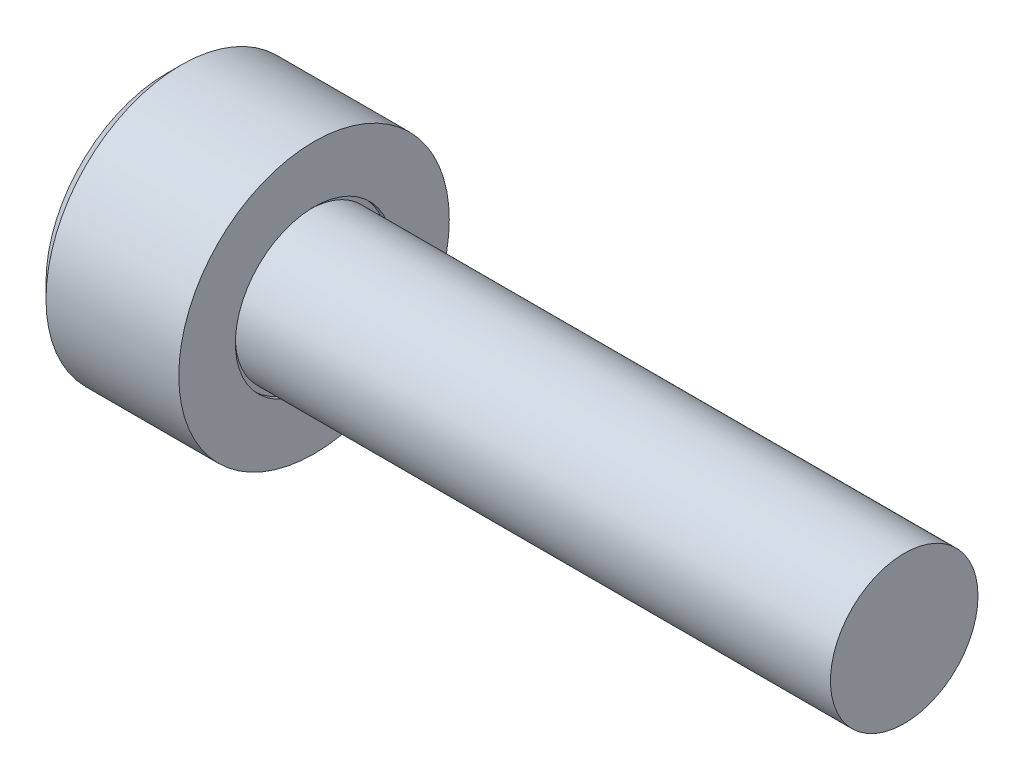
ISO-10303-21;
HEADER;
FILE_DESCRIPTION(('STEP AP214'),'2;1');
FILE_NAME('part.step','',(''),(''),'','','');
FILE_SCHEMA(('AUTOMOTIVE_DESIGN { 1 0 10303 214 1 1 1 1 }'));
ENDSEC;
DATA;
#1=APPLICATION_CONTEXT('core data for automotive mechanical design processes');
#2=APPLICATION_PROTOCOL_DEFINITION('international standard','automotive_design',2000,#1);
#3=PRODUCT_CONTEXT('',#1,'mechanical');
#4=PRODUCT('Part','Part','',(#3));
#5=PRODUCT_RELATED_PRODUCT_CATEGORY('part','',(#4));
#6=PRODUCT_DEFINITION_FORMATION('','',#4);
#7=PRODUCT_DEFINITION_CONTEXT('part definition',#1,'design');
#8=PRODUCT_DEFINITION('design','',#6,#7);
#9=PRODUCT_DEFINITION_SHAPE('','',#8);
#10=(LENGTH_UNIT() NAMED_UNIT(*) SI_UNIT(.MILLI.,.METRE.));
#11=(NAMED_UNIT(*) PLANE_ANGLE_UNIT() SI_UNIT($,.RADIAN.));
#12=(NAMED_UNIT(*) SI_UNIT($,.STERADIAN.) SOLID_ANGLE_UNIT());
#13=UNCERTAINTY_MEASURE_WITH_UNIT(LENGTH_MEASURE(1.E-05),#10,'distance_accuracy_value','');
#14=(GEOMETRIC_REPRESENTATION_CONTEXT(3) GLOBAL_UNCERTAINTY_ASSIGNED_CONTEXT((#13)) GLOBAL_UNIT_ASSIGNED_CONTEXT((#10,
#11,#12)) REPRESENTATION_CONTEXT('',''));
#15=CARTESIAN_POINT('',(0.,0.,0.));
#16=DIRECTION('',(0.,0.,1.));
#17=DIRECTION('',(1.,0.,0.));
#18=AXIS2_PLACEMENT_3D('',#15,#16,#17);
#19=CARTESIAN_POINT('',(100.,0.,0.));
#20=DIRECTION('',(-1.,0.,0.));
#21=DIRECTION('',(0.,0.,1.));
#22=AXIS2_PLACEMENT_3D('',#19,#20,#21);
#23=CYLINDRICAL_SURFACE('',#22,1.5);
#24=CARTESIAN_POINT('',(-0.1,0.,0.));
#25=DIRECTION('',(1.,0.,0.));
#26=DIRECTION('',(0.,0.,-1.));
#27=AXIS2_PLACEMENT_3D('',#24,#25,#26);
#28=CIRCLE('',#27,1.5);
#29=CARTESIAN_POINT('',(-0.1,0.,-1.5));
#30=VERTEX_POINT('',#29);
#31=EDGE_CURVE('E251',#30,#30,#28,.T.);
#32=ORIENTED_EDGE('',*,*,#31,.T.);
#33=EDGE_LOOP('',(#32));
#34=FACE_BOUND('',#33,.T.);
#35=CARTESIAN_POINT('',(12.,0.,0.));
#36=DIRECTION('',(1.,0.,0.));
#37=DIRECTION('',(0.,0.,-1.));
#38=AXIS2_PLACEMENT_3D('',#35,#36,#37);
#39=CIRCLE('',#38,1.5);
#40=CARTESIAN_POINT('',(12.,0.,-1.5));
#41=VERTEX_POINT('',#40);
#42=EDGE_CURVE('E12',#41,#41,#39,.T.);
#43=ORIENTED_EDGE('',*,*,#42,.F.);
#44=EDGE_LOOP('',(#43));
#45=FACE_BOUND('',#44,.T.);
#46=ADVANCED_FACE('F42',(#34,#45),#23,.T.);
#47=CARTESIAN_POINT('',(-1.5,0.,0.));
#48=DIRECTION('',(-1.,0.,0.));
#49=DIRECTION('',(0.,0.,1.));
#50=AXIS2_PLACEMENT_3D('',#47,#48,#49);
#51=PLANE('',#50);
#52=DIRECTION('',(0.,-0.866025403784439,-0.5));
#53=VECTOR('',#52,1.);
#54=CARTESIAN_POINT('',(-1.5,1.24707658144959,-0.72));
#55=LINE('',#54,#53);
#56=CARTESIAN_POINT('',(-1.5,1.24707658144959,-0.72));
#57=VERTEX_POINT('',#56);
#58=CARTESIAN_POINT('',(-1.5,0.623538290724796,-1.08));
#59=VERTEX_POINT('',#58);
#60=EDGE_CURVE('E198',#57,#59,#55,.T.);
#61=ORIENTED_EDGE('',*,*,#60,.T.);
#62=CARTESIAN_POINT('',(-1.5,0.,0.));
#63=DIRECTION('',(1.,0.,0.));
#64=DIRECTION('',(0.,0.,-1.));
#65=AXIS2_PLACEMENT_3D('',#62,#63,#64);
#66=CIRCLE('',#65,1.24707658144959);
#67=CARTESIAN_POINT('',(-1.5,1.24707658144959,0.));
#68=VERTEX_POINT('',#67);
#69=EDGE_CURVE('E58',#59,#68,#66,.T.);
#70=ORIENTED_EDGE('',*,*,#69,.T.);
#71=DIRECTION('',(0.,0.,-1.));
#72=VECTOR('',#71,1.);
#73=CARTESIAN_POINT('',(-1.5,1.24707658144959,0.72));
#74=LINE('',#73,#72);
#75=EDGE_CURVE('E229',#68,#57,#74,.T.);
#76=ORIENTED_EDGE('',*,*,#75,.T.);
#77=EDGE_LOOP('',(#61,#70,#76));
#78=FACE_BOUND('',#77,.T.);
#79=ADVANCED_FACE('F129',(#78),#51,.T.);
#80=CARTESIAN_POINT('',(-1.5,1.24707658144959,0.72));
#81=VERTEX_POINT('',#80);
#82=EDGE_CURVE('E224',#81,#68,#74,.T.);
#83=ORIENTED_EDGE('',*,*,#82,.T.);
#84=CARTESIAN_POINT('',(-1.5,0.623538290724796,1.08));
#85=VERTEX_POINT('',#84);
#86=EDGE_CURVE('E180',#68,#85,#66,.T.);
#87=ORIENTED_EDGE('',*,*,#86,.T.);
#88=DIRECTION('',(0.,0.866025403784439,-0.5));
#89=VECTOR('',#88,1.);
#90=CARTESIAN_POINT('',(-1.5,0.,1.44));
#91=LINE('',#90,#89);
#92=EDGE_CURVE('E237',#85,#81,#91,.T.);
#93=ORIENTED_EDGE('',*,*,#92,.T.);
#94=EDGE_LOOP('',(#83,#87,#93));
#95=FACE_BOUND('',#94,.T.);
#96=ADVANCED_FACE('F138',(#95),#51,.T.);
#97=CARTESIAN_POINT('',(-1.5,0.,1.44));
#98=VERTEX_POINT('',#97);
#99=EDGE_CURVE('E233',#98,#85,#91,.T.);
#100=ORIENTED_EDGE('',*,*,#99,.T.);
#101=CARTESIAN_POINT('',(-1.5,-0.623538290724796,1.08));
#102=VERTEX_POINT('',#101);
#103=EDGE_CURVE('E418',#85,#102,#66,.T.);
#104=ORIENTED_EDGE('',*,*,#103,.T.);
#105=DIRECTION('',(0.,0.866025403784439,0.5));
#106=VECTOR('',#105,1.);
#107=CARTESIAN_POINT('',(-1.5,-1.24707658144959,0.72));
#108=LINE('',#107,#106);
#109=EDGE_CURVE('E241',#102,#98,#108,.T.);
#110=ORIENTED_EDGE('',*,*,#109,.T.);
#111=EDGE_LOOP('',(#100,#104,#110));
#112=FACE_BOUND('',#111,.T.);
#113=ADVANCED_FACE('F392',(#112),#51,.T.);
#114=CARTESIAN_POINT('',(-1.5,-1.24707658144959,0.72));
#115=VERTEX_POINT('',#114);
#116=EDGE_CURVE('E238',#115,#102,#108,.T.);
#117=ORIENTED_EDGE('',*,*,#116,.T.);
#118=CARTESIAN_POINT('',(-1.5,-1.24707658144959,0.));
#119=VERTEX_POINT('',#118);
#120=EDGE_CURVE('E423',#102,#119,#66,.T.);
#121=ORIENTED_EDGE('',*,*,#120,.T.);
#122=DIRECTION('',(0.,0.,1.));
#123=VECTOR('',#122,1.);
#124=CARTESIAN_POINT('',(-1.5,-1.24707658144959,-0.72));
#125=LINE('',#124,#123);
#126=EDGE_CURVE('E245',#119,#115,#125,.T.);
#127=ORIENTED_EDGE('',*,*,#126,.T.);
#128=EDGE_LOOP('',(#117,#121,#127));
#129=FACE_BOUND('',#128,.T.);
#130=ADVANCED_FACE('F159',(#129),#51,.T.);
#131=CARTESIAN_POINT('',(-1.5,-1.24707658144959,-0.72));
#132=VERTEX_POINT('',#131);
#133=EDGE_CURVE('E242',#132,#119,#125,.T.);
#134=ORIENTED_EDGE('',*,*,#133,.T.);
#135=CARTESIAN_POINT('',(-1.5,-0.623538290724796,-1.08));
#136=VERTEX_POINT('',#135);
#137=EDGE_CURVE('E172',#119,#136,#66,.T.);
#138=ORIENTED_EDGE('',*,*,#137,.T.);
#139=DIRECTION('',(0.,-0.866025403784439,0.5));
#140=VECTOR('',#139,1.);
#141=CARTESIAN_POINT('',(-1.5,0.,-1.44));
#142=LINE('',#141,#140);
#143=EDGE_CURVE('E209',#136,#132,#142,.T.);
#144=ORIENTED_EDGE('',*,*,#143,.T.);
#145=EDGE_LOOP('',(#134,#138,#144));
#146=FACE_BOUND('',#145,.T.);
#147=ADVANCED_FACE('F130',(#146),#51,.T.);
#148=CARTESIAN_POINT('',(-3.,0.,0.));
#149=DIRECTION('',(1.,0.,0.));
#150=DIRECTION('',(0.,0.,-1.));
#151=AXIS2_PLACEMENT_3D('',#148,#149,#150);
#152=CYLINDRICAL_SURFACE('',#151,2.75);
#153=CARTESIAN_POINT('',(-2.7,0.,0.));
#154=DIRECTION('',(-1.,0.,0.));
#155=DIRECTION('',(0.,0.,1.));
#156=AXIS2_PLACEMENT_3D('',#153,#154,#155);
#157=CIRCLE('',#156,2.75);
#158=CARTESIAN_POINT('',(-2.7,0.,2.75));
#159=VERTEX_POINT('',#158);
#160=EDGE_CURVE('E164',#159,#159,#157,.F.);
#161=ORIENTED_EDGE('',*,*,#160,.T.);
#162=EDGE_LOOP('',(#161));
#163=FACE_BOUND('',#162,.T.);
#164=CARTESIAN_POINT('',(0.,0.,0.));
#165=DIRECTION('',(1.,0.,0.));
#166=DIRECTION('',(0.,0.,-1.));
#167=AXIS2_PLACEMENT_3D('',#164,#165,#166);
#168=CIRCLE('',#167,2.75);
#169=CARTESIAN_POINT('',(0.,0.,-2.75));
#170=VERTEX_POINT('',#169);
#171=EDGE_CURVE('E167',#170,#170,#168,.T.);
#172=ORIENTED_EDGE('',*,*,#171,.F.);
#173=EDGE_LOOP('',(#172));
#174=FACE_BOUND('',#173,.T.);
#175=ADVANCED_FACE('F152',(#163,#174),#152,.T.);
#176=CARTESIAN_POINT('',(-3.,2.75,0.));
#177=DIRECTION('',(-1.,0.,0.));
#178=DIRECTION('',(0.,0.,1.));
#179=AXIS2_PLACEMENT_3D('',#176,#177,#178);
#180=PLANE('',#179);
#181=CARTESIAN_POINT('',(-3.,0.,0.));
#182=DIRECTION('',(-1.,0.,0.));
#183=DIRECTION('',(0.,0.,1.));
#184=AXIS2_PLACEMENT_3D('',#181,#182,#183);
#185=CIRCLE('',#184,2.45000000000001);
#186=CARTESIAN_POINT('',(-3.,0.,2.45000000000001));
#187=VERTEX_POINT('',#186);
#188=EDGE_CURVE('E51',#187,#187,#185,.T.);
#189=ORIENTED_EDGE('',*,*,#188,.T.);
#190=EDGE_LOOP('',(#189));
#191=FACE_BOUND('',#190,.T.);
#192=DIRECTION('',(0.,-0.866025403784439,0.5));
#193=VECTOR('',#192,1.);
#194=CARTESIAN_POINT('',(-3.,0.,-1.44));
#195=LINE('',#194,#193);
#196=CARTESIAN_POINT('',(-3.,0.,-1.44));
#197=VERTEX_POINT('',#196);
#198=CARTESIAN_POINT('',(-3.,-1.24707658144959,-0.72));
#199=VERTEX_POINT('',#198);
#200=EDGE_CURVE('E66',#197,#199,#195,.T.);
#201=ORIENTED_EDGE('',*,*,#200,.F.);
#202=DIRECTION('',(0.,-0.866025403784439,-0.5));
#203=VECTOR('',#202,1.);
#204=CARTESIAN_POINT('',(-3.,1.24707658144959,-0.72));
#205=LINE('',#204,#203);
#206=CARTESIAN_POINT('',(-3.,1.24707658144959,-0.72));
#207=VERTEX_POINT('',#206);
#208=EDGE_CURVE('E189',#207,#197,#205,.T.);
#209=ORIENTED_EDGE('',*,*,#208,.F.);
#210=DIRECTION('',(0.,0.,-1.));
#211=VECTOR('',#210,1.);
#212=CARTESIAN_POINT('',(-3.,1.24707658144959,0.72));
#213=LINE('',#212,#211);
#214=CARTESIAN_POINT('',(-3.,1.24707658144959,0.72));
#215=VERTEX_POINT('',#214);
#216=EDGE_CURVE('E206',#215,#207,#213,.T.);
#217=ORIENTED_EDGE('',*,*,#216,.F.);
#218=DIRECTION('',(0.,0.866025403784439,-0.5));
#219=VECTOR('',#218,1.);
#220=CARTESIAN_POINT('',(-3.,0.,1.44));
#221=LINE('',#220,#219);
#222=CARTESIAN_POINT('',(-3.,0.,1.44));
#223=VERTEX_POINT('',#222);
#224=EDGE_CURVE('E203',#223,#215,#221,.T.);
#225=ORIENTED_EDGE('',*,*,#224,.F.);
#226=DIRECTION('',(0.,0.866025403784439,0.5));
#227=VECTOR('',#226,1.);
#228=CARTESIAN_POINT('',(-3.,-1.24707658144959,0.72));
#229=LINE('',#228,#227);
#230=CARTESIAN_POINT('',(-3.,-1.24707658144959,0.72));
#231=VERTEX_POINT('',#230);
#232=EDGE_CURVE('E194',#231,#223,#229,.T.);
#233=ORIENTED_EDGE('',*,*,#232,.F.);
#234=DIRECTION('',(0.,0.,1.));
#235=VECTOR('',#234,1.);
#236=CARTESIAN_POINT('',(-3.,-1.24707658144959,-0.72));
#237=LINE('',#236,#235);
#238=EDGE_CURVE('E192',#199,#231,#237,.T.);
#239=ORIENTED_EDGE('',*,*,#238,.F.);
#240=EDGE_LOOP('',(#201,#209,#217,#225,#233,#239));
#241=FACE_BOUND('',#240,.T.);
#242=ADVANCED_FACE('F149',(#191,#241),#180,.T.);
#243=CARTESIAN_POINT('',(0.,0.,0.));
#244=DIRECTION('',(1.,0.,0.));
#245=DIRECTION('',(0.,0.,-1.));
#246=AXIS2_PLACEMENT_3D('',#243,#244,#245);
#247=PLANE('',#246);
#248=CARTESIAN_POINT('',(0.,0.,0.));
#249=DIRECTION('',(1.,0.,0.));
#250=DIRECTION('',(0.,0.,-1.));
#251=AXIS2_PLACEMENT_3D('',#248,#249,#250);
#252=CIRCLE('',#251,1.6);
#253=CARTESIAN_POINT('',(0.,0.,-1.6));
#254=VERTEX_POINT('',#253);
#255=EDGE_CURVE('E248',#254,#254,#252,.T.);
#256=ORIENTED_EDGE('',*,*,#255,.F.);
#257=EDGE_LOOP('',(#256));
#258=FACE_BOUND('',#257,.T.);
#259=ORIENTED_EDGE('',*,*,#171,.T.);
#260=EDGE_LOOP('',(#259));
#261=FACE_BOUND('',#260,.T.);
#262=ADVANCED_FACE('F146',(#258,#261),#247,.T.);
#263=CARTESIAN_POINT('',(-1.5,0.,-1.44));
#264=DIRECTION('',(0.,-0.5,-0.866025403784439));
#265=DIRECTION('',(0.,0.866025403784439,-0.5));
#266=AXIS2_PLACEMENT_3D('',#263,#264,#265);
#267=PLANE('',#266);
#268=ORIENTED_EDGE('',*,*,#200,.T.);
#269=DIRECTION('',(-1.,0.,0.));
#270=VECTOR('',#269,1.);
#271=CARTESIAN_POINT('',(-1.5,-1.24707658144959,-0.72));
#272=LINE('',#271,#270);
#273=EDGE_CURVE('E178',#132,#199,#272,.T.);
#274=ORIENTED_EDGE('',*,*,#273,.F.);
#275=ORIENTED_EDGE('',*,*,#143,.F.);
#276=CARTESIAN_POINT('',(-1.5,0.,-1.44));
#277=VERTEX_POINT('',#276);
#278=EDGE_CURVE('E246',#277,#136,#142,.T.);
#279=ORIENTED_EDGE('',*,*,#278,.F.);
#280=DIRECTION('',(-1.,0.,0.));
#281=VECTOR('',#280,1.);
#282=CARTESIAN_POINT('',(-1.5,0.,-1.44));
#283=LINE('',#282,#281);
#284=EDGE_CURVE('E170',#277,#197,#283,.T.);
#285=ORIENTED_EDGE('',*,*,#284,.T.);
#286=EDGE_LOOP('',(#268,#274,#275,#279,#285));
#287=FACE_BOUND('',#286,.T.);
#288=ADVANCED_FACE('F144',(#287),#267,.F.);
#289=CARTESIAN_POINT('',(-1.5,1.24707658144959,-0.72));
#290=DIRECTION('',(0.,0.5,-0.866025403784439));
#291=DIRECTION('',(0.,0.866025403784439,0.5));
#292=AXIS2_PLACEMENT_3D('',#289,#290,#291);
#293=PLANE('',#292);
#294=ORIENTED_EDGE('',*,*,#208,.T.);
#295=ORIENTED_EDGE('',*,*,#284,.F.);
#296=EDGE_CURVE('E222',#59,#277,#55,.T.);
#297=ORIENTED_EDGE('',*,*,#296,.F.);
#298=ORIENTED_EDGE('',*,*,#60,.F.);
#299=DIRECTION('',(-1.,0.,0.));
#300=VECTOR('',#299,1.);
#301=CARTESIAN_POINT('',(-1.5,1.24707658144959,-0.72));
#302=LINE('',#301,#300);
#303=EDGE_CURVE('E174',#57,#207,#302,.T.);
#304=ORIENTED_EDGE('',*,*,#303,.T.);
#305=EDGE_LOOP('',(#294,#295,#297,#298,#304));
#306=FACE_BOUND('',#305,.T.);
#307=ADVANCED_FACE('F363',(#306),#293,.F.);
#308=CARTESIAN_POINT('',(-1.5,1.24707658144959,0.72));
#309=DIRECTION('',(0.,1.,0.));
#310=DIRECTION('',(0.,0.,1.));
#311=AXIS2_PLACEMENT_3D('',#308,#309,#310);
#312=PLANE('',#311);
#313=ORIENTED_EDGE('',*,*,#216,.T.);
#314=ORIENTED_EDGE('',*,*,#303,.F.);
#315=ORIENTED_EDGE('',*,*,#75,.F.);
#316=ORIENTED_EDGE('',*,*,#82,.F.);
#317=DIRECTION('',(-1.,0.,0.));
#318=VECTOR('',#317,1.);
#319=CARTESIAN_POINT('',(-1.5,1.24707658144959,0.72));
#320=LINE('',#319,#318);
#321=EDGE_CURVE('E212',#81,#215,#320,.T.);
#322=ORIENTED_EDGE('',*,*,#321,.T.);
#323=EDGE_LOOP('',(#313,#314,#315,#316,#322));
#324=FACE_BOUND('',#323,.T.);
#325=ADVANCED_FACE('F353',(#324),#312,.F.);
#326=CARTESIAN_POINT('',(-1.5,0.,1.44));
#327=DIRECTION('',(0.,0.5,0.866025403784439));
#328=DIRECTION('',(0.,-0.866025403784439,0.5));
#329=AXIS2_PLACEMENT_3D('',#326,#327,#328);
#330=PLANE('',#329);
#331=ORIENTED_EDGE('',*,*,#224,.T.);
#332=ORIENTED_EDGE('',*,*,#321,.F.);
#333=ORIENTED_EDGE('',*,*,#92,.F.);
#334=ORIENTED_EDGE('',*,*,#99,.F.);
#335=DIRECTION('',(-1.,0.,0.));
#336=VECTOR('',#335,1.);
#337=CARTESIAN_POINT('',(-1.5,0.,1.44));
#338=LINE('',#337,#336);
#339=EDGE_CURVE('E214',#98,#223,#338,.T.);
#340=ORIENTED_EDGE('',*,*,#339,.T.);
#341=EDGE_LOOP('',(#331,#332,#333,#334,#340));
#342=FACE_BOUND('',#341,.T.);
#343=ADVANCED_FACE('F344',(#342),#330,.F.);
#344=CARTESIAN_POINT('',(-1.5,-1.24707658144959,0.72));
#345=DIRECTION('',(0.,-0.5,0.866025403784439));
#346=DIRECTION('',(0.,-0.866025403784439,-0.5));
#347=AXIS2_PLACEMENT_3D('',#344,#345,#346);
#348=PLANE('',#347);
#349=ORIENTED_EDGE('',*,*,#232,.T.);
#350=ORIENTED_EDGE('',*,*,#339,.F.);
#351=ORIENTED_EDGE('',*,*,#109,.F.);
#352=ORIENTED_EDGE('',*,*,#116,.F.);
#353=DIRECTION('',(-1.,0.,0.));
#354=VECTOR('',#353,1.);
#355=CARTESIAN_POINT('',(-1.5,-1.24707658144959,0.72));
#356=LINE('',#355,#354);
#357=EDGE_CURVE('E215',#115,#231,#356,.T.);
#358=ORIENTED_EDGE('',*,*,#357,.T.);
#359=EDGE_LOOP('',(#349,#350,#351,#352,#358));
#360=FACE_BOUND('',#359,.T.);
#361=ADVANCED_FACE('F336',(#360),#348,.F.);
#362=CARTESIAN_POINT('',(-1.5,-1.24707658144959,-0.72));
#363=DIRECTION('',(0.,-1.,0.));
#364=DIRECTION('',(0.,0.,-1.));
#365=AXIS2_PLACEMENT_3D('',#362,#363,#364);
#366=PLANE('',#365);
#367=ORIENTED_EDGE('',*,*,#238,.T.);
#368=ORIENTED_EDGE('',*,*,#357,.F.);
#369=ORIENTED_EDGE('',*,*,#126,.F.);
#370=ORIENTED_EDGE('',*,*,#133,.F.);
#371=ORIENTED_EDGE('',*,*,#273,.T.);
#372=EDGE_LOOP('',(#367,#368,#369,#370,#371));
#373=FACE_BOUND('',#372,.T.);
#374=ADVANCED_FACE('F126',(#373),#366,.F.);
#375=ORIENTED_EDGE('',*,*,#278,.T.);
#376=EDGE_CURVE('E169',#136,#59,#66,.T.);
#377=ORIENTED_EDGE('',*,*,#376,.T.);
#378=ORIENTED_EDGE('',*,*,#296,.T.);
#379=EDGE_LOOP('',(#375,#377,#378));
#380=FACE_BOUND('',#379,.T.);
#381=ADVANCED_FACE('F118',(#380),#51,.T.);
#382=CARTESIAN_POINT('',(-1.1650635094611,0.,0.));
#383=DIRECTION('',(-1.,0.,0.));
#384=DIRECTION('',(0.,0.,1.));
#385=AXIS2_PLACEMENT_3D('',#382,#383,#384);
#386=CONICAL_SURFACE('',#385,0.,1.30841097674233);
#387=ORIENTED_EDGE('',*,*,#69,.F.);
#388=ORIENTED_EDGE('',*,*,#376,.F.);
#389=ORIENTED_EDGE('',*,*,#137,.F.);
#390=ORIENTED_EDGE('',*,*,#120,.F.);
#391=ORIENTED_EDGE('',*,*,#103,.F.);
#392=ORIENTED_EDGE('',*,*,#86,.F.);
#393=EDGE_LOOP('',(#387,#388,#389,#390,#391,#392));
#394=FACE_BOUND('',#393,.T.);
#395=CARTESIAN_POINT('',(-1.1650635094611,0.,0.));
#396=VERTEX_POINT('',#395);
#397=VERTEX_LOOP('',#396);
#398=FACE_BOUND('',#397,.T.);
#399=ADVANCED_FACE('F116',(#394,#398),#386,.F.);
#400=CARTESIAN_POINT('',(-2.7,0.,0.));
#401=DIRECTION('',(1.,0.,0.));
#402=DIRECTION('',(0.,0.,-1.));
#403=AXIS2_PLACEMENT_3D('',#400,#401,#402);
#404=CONICAL_SURFACE('',#403,2.75,0.785398163397441);
#405=ORIENTED_EDGE('',*,*,#188,.F.);
#406=EDGE_LOOP('',(#405));
#407=FACE_BOUND('',#406,.T.);
#408=ORIENTED_EDGE('',*,*,#160,.F.);
#409=EDGE_LOOP('',(#408));
#410=FACE_BOUND('',#409,.T.);
#411=ADVANCED_FACE('F45',(#407,#410),#404,.T.);
#412=CARTESIAN_POINT('',(-0.1,0.,0.));
#413=DIRECTION('',(1.,0.,0.));
#414=DIRECTION('',(0.,0.,-1.));
#415=AXIS2_PLACEMENT_3D('',#412,#413,#414);
#416=CYLINDRICAL_SURFACE('',#415,1.6);
#417=CARTESIAN_POINT('',(-0.1,0.,0.));
#418=DIRECTION('',(1.,0.,0.));
#419=DIRECTION('',(0.,0.,-1.));
#420=AXIS2_PLACEMENT_3D('',#417,#418,#419);
#421=CIRCLE('',#420,1.6);
#422=CARTESIAN_POINT('',(-0.1,0.,-1.6));
#423=VERTEX_POINT('',#422);
#424=EDGE_CURVE('E196',#423,#423,#421,.T.);
#425=ORIENTED_EDGE('',*,*,#424,.F.);
#426=EDGE_LOOP('',(#425));
#427=FACE_BOUND('',#426,.T.);
#428=ORIENTED_EDGE('',*,*,#255,.T.);
#429=EDGE_LOOP('',(#428));
#430=FACE_BOUND('',#429,.T.);
#431=ADVANCED_FACE('F124',(#427,#430),#416,.F.);
#432=CARTESIAN_POINT('',(-0.1,0.,0.));
#433=DIRECTION('',(1.,0.,0.));
#434=DIRECTION('',(0.,0.,-1.));
#435=AXIS2_PLACEMENT_3D('',#432,#433,#434);
#436=PLANE('',#435);
#437=ORIENTED_EDGE('',*,*,#31,.F.);
#438=EDGE_LOOP('',(#437));
#439=FACE_BOUND('',#438,.T.);
#440=ORIENTED_EDGE('',*,*,#424,.T.);
#441=EDGE_LOOP('',(#440));
#442=FACE_BOUND('',#441,.T.);
#443=ADVANCED_FACE('F256',(#439,#442),#436,.T.);
#444=CARTESIAN_POINT('',(12.,0.,0.));
#445=DIRECTION('',(1.,0.,0.));
#446=DIRECTION('',(0.,0.,-1.));
#447=AXIS2_PLACEMENT_3D('',#444,#445,#446);
#448=PLANE('',#447);
#449=ORIENTED_EDGE('',*,*,#42,.T.);
#450=EDGE_LOOP('',(#449));
#451=FACE_BOUND('',#450,.T.);
#452=ADVANCED_FACE('F259',(#451),#448,.T.);
#453=CLOSED_SHELL('',(#46,#79,#96,#113,#130,#147,#175,#242,#262,#288,#307,#325,#343,#361,#374,
#381,#399,#411,#431,#443,#452));
#454=MANIFOLD_SOLID_BREP('B2',#453);
#455=ADVANCED_BREP_SHAPE_REPRESENTATION('',(#18,#454),#14);
#456=SHAPE_DEFINITION_REPRESENTATION(#9,#455);
ENDSEC;
END-ISO-10303-21;
